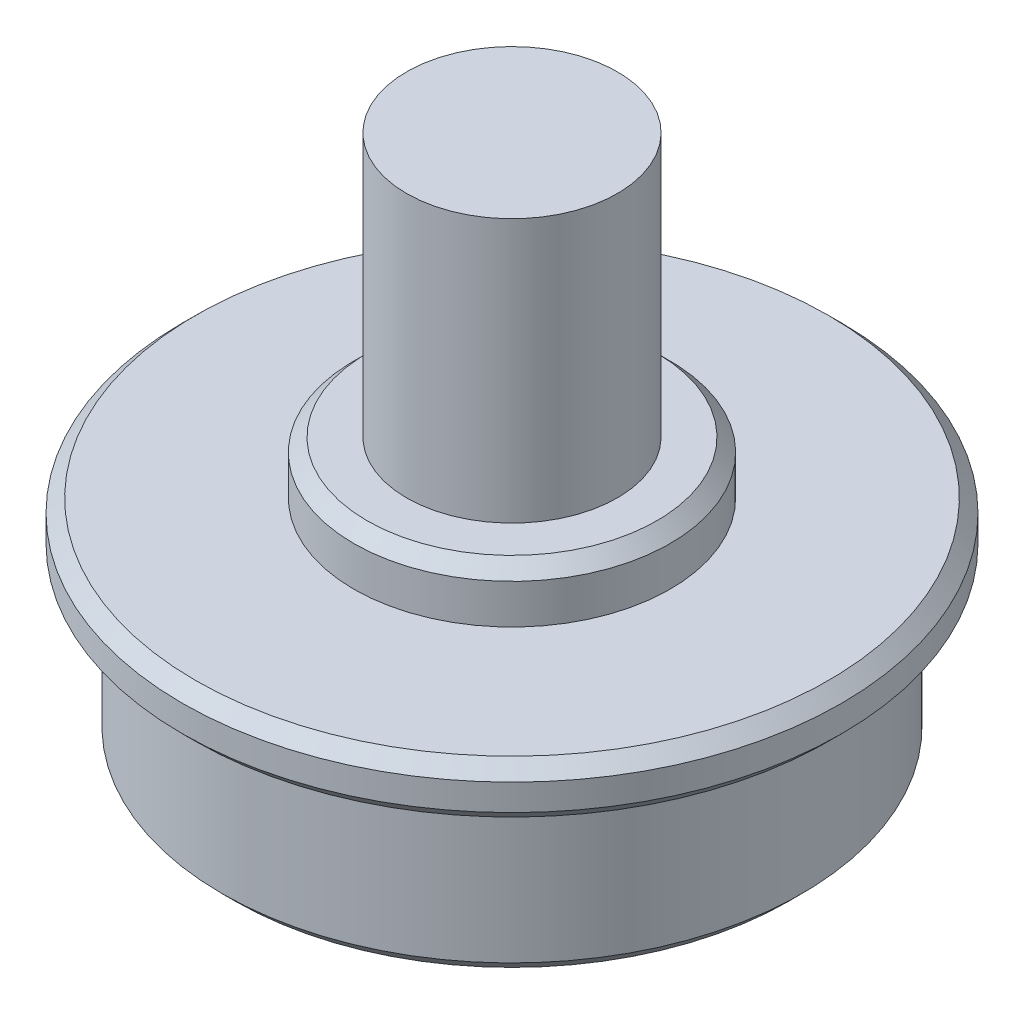
ISO-10303-21;
HEADER;
FILE_DESCRIPTION(('STEP AP214'),'2;1');
FILE_NAME('part.step','',(''),(''),'','','');
FILE_SCHEMA(('AUTOMOTIVE_DESIGN { 1 0 10303 214 1 1 1 1 }'));
ENDSEC;
DATA;
#1=APPLICATION_CONTEXT('core data for automotive mechanical design processes');
#2=APPLICATION_PROTOCOL_DEFINITION('international standard','automotive_design',2000,#1);
#3=PRODUCT_CONTEXT('',#1,'mechanical');
#4=PRODUCT('Part','Part','',(#3));
#5=PRODUCT_RELATED_PRODUCT_CATEGORY('part','',(#4));
#6=PRODUCT_DEFINITION_FORMATION('','',#4);
#7=PRODUCT_DEFINITION_CONTEXT('part definition',#1,'design');
#8=PRODUCT_DEFINITION('design','',#6,#7);
#9=PRODUCT_DEFINITION_SHAPE('','',#8);
#10=(LENGTH_UNIT() NAMED_UNIT(*) SI_UNIT(.MILLI.,.METRE.));
#11=(NAMED_UNIT(*) PLANE_ANGLE_UNIT() SI_UNIT($,.RADIAN.));
#12=(NAMED_UNIT(*) SI_UNIT($,.STERADIAN.) SOLID_ANGLE_UNIT());
#13=UNCERTAINTY_MEASURE_WITH_UNIT(LENGTH_MEASURE(1.E-05),#10,'distance_accuracy_value','');
#14=(GEOMETRIC_REPRESENTATION_CONTEXT(3) GLOBAL_UNCERTAINTY_ASSIGNED_CONTEXT((#13)) GLOBAL_UNIT_ASSIGNED_CONTEXT((#10,
#11,#12)) REPRESENTATION_CONTEXT('',''));
#15=CARTESIAN_POINT('',(0.,0.,0.));
#16=DIRECTION('',(0.,0.,1.));
#17=DIRECTION('',(1.,0.,0.));
#18=AXIS2_PLACEMENT_3D('',#15,#16,#17);
#19=CARTESIAN_POINT('',(0.,1.,0.));
#20=DIRECTION('',(0.,-1.,0.));
#21=DIRECTION('',(0.,0.,-1.));
#22=AXIS2_PLACEMENT_3D('',#19,#20,#21);
#23=CYLINDRICAL_SURFACE('',#22,6.25);
#24=CARTESIAN_POINT('',(0.,0.250000000000003,0.));
#25=DIRECTION('',(0.,1.,0.));
#26=DIRECTION('',(0.,0.,1.));
#27=AXIS2_PLACEMENT_3D('',#24,#25,#26);
#28=CIRCLE('',#27,6.25);
#29=CARTESIAN_POINT('',(0.,0.250000000000003,6.25));
#30=VERTEX_POINT('',#29);
#31=EDGE_CURVE('E78',#30,#30,#28,.T.);
#32=ORIENTED_EDGE('',*,*,#31,.T.);
#33=EDGE_LOOP('',(#32));
#34=FACE_BOUND('',#33,.T.);
#35=CARTESIAN_POINT('',(0.,0.749999999999999,0.));
#36=DIRECTION('',(0.,1.,0.));
#37=DIRECTION('',(0.,0.,1.));
#38=AXIS2_PLACEMENT_3D('',#35,#36,#37);
#39=CIRCLE('',#38,6.25);
#40=CARTESIAN_POINT('',(0.,0.749999999999999,6.25));
#41=VERTEX_POINT('',#40);
#42=EDGE_CURVE('E82',#41,#41,#39,.F.);
#43=ORIENTED_EDGE('',*,*,#42,.T.);
#44=EDGE_LOOP('',(#43));
#45=FACE_BOUND('',#44,.T.);
#46=ADVANCED_FACE('F45',(#34,#45),#23,.T.);
#47=CARTESIAN_POINT('',(0.,1.,0.));
#48=DIRECTION('',(0.,1.,0.));
#49=DIRECTION('',(0.,0.,1.));
#50=AXIS2_PLACEMENT_3D('',#47,#48,#49);
#51=PLANE('',#50);
#52=CARTESIAN_POINT('',(0.,1.,0.));
#53=DIRECTION('',(0.,1.,0.));
#54=DIRECTION('',(0.,0.,1.));
#55=AXIS2_PLACEMENT_3D('',#52,#53,#54);
#56=CIRCLE('',#55,6.);
#57=CARTESIAN_POINT('',(0.,1.,6.));
#58=VERTEX_POINT('',#57);
#59=EDGE_CURVE('E59',#58,#58,#56,.T.);
#60=ORIENTED_EDGE('',*,*,#59,.T.);
#61=EDGE_LOOP('',(#60));
#62=FACE_BOUND('',#61,.T.);
#63=CARTESIAN_POINT('',(0.,1.,0.));
#64=DIRECTION('',(0.,1.,0.));
#65=DIRECTION('',(0.,0.,1.));
#66=AXIS2_PLACEMENT_3D('',#63,#64,#65);
#67=CIRCLE('',#66,3.);
#68=CARTESIAN_POINT('',(0.,1.,3.));
#69=VERTEX_POINT('',#68);
#70=EDGE_CURVE('E91',#69,#69,#67,.T.);
#71=ORIENTED_EDGE('',*,*,#70,.F.);
#72=EDGE_LOOP('',(#71));
#73=FACE_BOUND('',#72,.T.);
#74=ADVANCED_FACE('F121',(#62,#73),#51,.T.);
#75=CARTESIAN_POINT('',(0.,0.,0.));
#76=DIRECTION('',(0.,1.,0.));
#77=DIRECTION('',(0.,0.,1.));
#78=AXIS2_PLACEMENT_3D('',#75,#76,#77);
#79=PLANE('',#78);
#80=CARTESIAN_POINT('',(0.,0.,0.));
#81=DIRECTION('',(0.,1.,0.));
#82=DIRECTION('',(0.,0.,1.));
#83=AXIS2_PLACEMENT_3D('',#80,#81,#82);
#84=CIRCLE('',#83,6.);
#85=CARTESIAN_POINT('',(0.,0.,6.));
#86=VERTEX_POINT('',#85);
#87=EDGE_CURVE('E74',#86,#86,#84,.F.);
#88=ORIENTED_EDGE('',*,*,#87,.T.);
#89=EDGE_LOOP('',(#88));
#90=FACE_BOUND('',#89,.T.);
#91=CARTESIAN_POINT('',(0.,0.,0.));
#92=DIRECTION('',(0.,-1.,0.));
#93=DIRECTION('',(0.,0.,-1.));
#94=AXIS2_PLACEMENT_3D('',#91,#92,#93);
#95=CIRCLE('',#94,5.5);
#96=CARTESIAN_POINT('',(0.,0.,-5.5));
#97=VERTEX_POINT('',#96);
#98=EDGE_CURVE('E87',#97,#97,#95,.T.);
#99=ORIENTED_EDGE('',*,*,#98,.F.);
#100=EDGE_LOOP('',(#99));
#101=FACE_BOUND('',#100,.T.);
#102=ADVANCED_FACE('F127',(#90,#101),#79,.F.);
#103=CARTESIAN_POINT('',(0.,-3.,0.));
#104=DIRECTION('',(0.,1.,0.));
#105=DIRECTION('',(0.,0.,1.));
#106=AXIS2_PLACEMENT_3D('',#103,#104,#105);
#107=CYLINDRICAL_SURFACE('',#106,5.5);
#108=CARTESIAN_POINT('',(0.,-2.74999999999999,0.));
#109=DIRECTION('',(0.,-1.,0.));
#110=DIRECTION('',(0.,0.,-1.));
#111=AXIS2_PLACEMENT_3D('',#108,#109,#110);
#112=CIRCLE('',#111,5.5);
#113=CARTESIAN_POINT('',(0.,-2.74999999999999,-5.5));
#114=VERTEX_POINT('',#113);
#115=EDGE_CURVE('E64',#114,#114,#112,.F.);
#116=ORIENTED_EDGE('',*,*,#115,.T.);
#117=EDGE_LOOP('',(#116));
#118=FACE_BOUND('',#117,.T.);
#119=ORIENTED_EDGE('',*,*,#98,.T.);
#120=EDGE_LOOP('',(#119));
#121=FACE_BOUND('',#120,.T.);
#122=ADVANCED_FACE('F203',(#118,#121),#107,.T.);
#123=CARTESIAN_POINT('',(0.,-3.,0.));
#124=DIRECTION('',(0.,-1.,0.));
#125=DIRECTION('',(0.,0.,-1.));
#126=AXIS2_PLACEMENT_3D('',#123,#124,#125);
#127=PLANE('',#126);
#128=CARTESIAN_POINT('',(0.,-3.,0.));
#129=DIRECTION('',(0.,-1.,0.));
#130=DIRECTION('',(0.,0.,-1.));
#131=AXIS2_PLACEMENT_3D('',#128,#129,#130);
#132=CIRCLE('',#131,5.25);
#133=CARTESIAN_POINT('',(0.,-3.,-5.25));
#134=VERTEX_POINT('',#133);
#135=EDGE_CURVE('E70',#134,#134,#132,.T.);
#136=ORIENTED_EDGE('',*,*,#135,.T.);
#137=EDGE_LOOP('',(#136));
#138=FACE_BOUND('',#137,.T.);
#139=ADVANCED_FACE('F118',(#138),#127,.T.);
#140=CARTESIAN_POINT('',(0.,2.,0.));
#141=DIRECTION('',(0.,-1.,0.));
#142=DIRECTION('',(0.,0.,-1.));
#143=AXIS2_PLACEMENT_3D('',#140,#141,#142);
#144=CYLINDRICAL_SURFACE('',#143,3.);
#145=CARTESIAN_POINT('',(0.,1.75,0.));
#146=DIRECTION('',(0.,1.,0.));
#147=DIRECTION('',(0.,0.,1.));
#148=AXIS2_PLACEMENT_3D('',#145,#146,#147);
#149=CIRCLE('',#148,3.);
#150=CARTESIAN_POINT('',(0.,1.75,3.));
#151=VERTEX_POINT('',#150);
#152=EDGE_CURVE('E10',#151,#151,#149,.F.);
#153=ORIENTED_EDGE('',*,*,#152,.T.);
#154=EDGE_LOOP('',(#153));
#155=FACE_BOUND('',#154,.T.);
#156=ORIENTED_EDGE('',*,*,#70,.T.);
#157=EDGE_LOOP('',(#156));
#158=FACE_BOUND('',#157,.T.);
#159=ADVANCED_FACE('F113',(#155,#158),#144,.T.);
#160=CARTESIAN_POINT('',(0.,2.,0.));
#161=DIRECTION('',(0.,1.,0.));
#162=DIRECTION('',(0.,0.,1.));
#163=AXIS2_PLACEMENT_3D('',#160,#161,#162);
#164=PLANE('',#163);
#165=CARTESIAN_POINT('',(0.,2.,0.));
#166=DIRECTION('',(0.,1.,0.));
#167=DIRECTION('',(0.,0.,1.));
#168=AXIS2_PLACEMENT_3D('',#165,#166,#167);
#169=CIRCLE('',#168,2.75000000000001);
#170=CARTESIAN_POINT('',(0.,2.,2.75000000000001));
#171=VERTEX_POINT('',#170);
#172=EDGE_CURVE('E54',#171,#171,#169,.T.);
#173=ORIENTED_EDGE('',*,*,#172,.T.);
#174=EDGE_LOOP('',(#173));
#175=FACE_BOUND('',#174,.T.);
#176=CARTESIAN_POINT('',(0.,2.,0.));
#177=DIRECTION('',(0.,1.,0.));
#178=DIRECTION('',(0.,0.,1.));
#179=AXIS2_PLACEMENT_3D('',#176,#177,#178);
#180=CIRCLE('',#179,2.);
#181=CARTESIAN_POINT('',(0.,2.,2.));
#182=VERTEX_POINT('',#181);
#183=EDGE_CURVE('E86',#182,#182,#180,.T.);
#184=ORIENTED_EDGE('',*,*,#183,.F.);
#185=EDGE_LOOP('',(#184));
#186=FACE_BOUND('',#185,.T.);
#187=ADVANCED_FACE('F108',(#175,#186),#164,.T.);
#188=CARTESIAN_POINT('',(0.,7.,0.));
#189=DIRECTION('',(0.,-1.,0.));
#190=DIRECTION('',(0.,0.,-1.));
#191=AXIS2_PLACEMENT_3D('',#188,#189,#190);
#192=CYLINDRICAL_SURFACE('',#191,2.);
#193=CARTESIAN_POINT('',(0.,7.,0.));
#194=DIRECTION('',(0.,1.,0.));
#195=DIRECTION('',(0.,0.,1.));
#196=AXIS2_PLACEMENT_3D('',#193,#194,#195);
#197=CIRCLE('',#196,2.);
#198=CARTESIAN_POINT('',(0.,7.,2.));
#199=VERTEX_POINT('',#198);
#200=EDGE_CURVE('E92',#199,#199,#197,.T.);
#201=ORIENTED_EDGE('',*,*,#200,.F.);
#202=EDGE_LOOP('',(#201));
#203=FACE_BOUND('',#202,.T.);
#204=ORIENTED_EDGE('',*,*,#183,.T.);
#205=EDGE_LOOP('',(#204));
#206=FACE_BOUND('',#205,.T.);
#207=ADVANCED_FACE('F105',(#203,#206),#192,.T.);
#208=CARTESIAN_POINT('',(0.,7.,0.));
#209=DIRECTION('',(0.,1.,0.));
#210=DIRECTION('',(0.,0.,1.));
#211=AXIS2_PLACEMENT_3D('',#208,#209,#210);
#212=PLANE('',#211);
#213=ORIENTED_EDGE('',*,*,#200,.T.);
#214=EDGE_LOOP('',(#213));
#215=FACE_BOUND('',#214,.T.);
#216=ADVANCED_FACE('F103',(#215),#212,.T.);
#217=CARTESIAN_POINT('',(0.,0.250000000000003,0.));
#218=DIRECTION('',(0.,1.,0.));
#219=DIRECTION('',(0.,0.,1.));
#220=AXIS2_PLACEMENT_3D('',#217,#218,#219);
#221=CONICAL_SURFACE('',#220,6.25,0.785398163397447);
#222=ORIENTED_EDGE('',*,*,#87,.F.);
#223=EDGE_LOOP('',(#222));
#224=FACE_BOUND('',#223,.T.);
#225=ORIENTED_EDGE('',*,*,#31,.F.);
#226=EDGE_LOOP('',(#225));
#227=FACE_BOUND('',#226,.T.);
#228=ADVANCED_FACE('F134',(#224,#227),#221,.T.);
#229=CARTESIAN_POINT('',(0.,-3.,0.));
#230=DIRECTION('',(0.,1.,0.));
#231=DIRECTION('',(0.,0.,1.));
#232=AXIS2_PLACEMENT_3D('',#229,#230,#231);
#233=CONICAL_SURFACE('',#232,5.25,0.785398163397441);
#234=ORIENTED_EDGE('',*,*,#115,.F.);
#235=EDGE_LOOP('',(#234));
#236=FACE_BOUND('',#235,.T.);
#237=ORIENTED_EDGE('',*,*,#135,.F.);
#238=EDGE_LOOP('',(#237));
#239=FACE_BOUND('',#238,.T.);
#240=ADVANCED_FACE('F140',(#236,#239),#233,.T.);
#241=CARTESIAN_POINT('',(0.,1.,0.));
#242=DIRECTION('',(0.,-1.,0.));
#243=DIRECTION('',(0.,0.,-1.));
#244=AXIS2_PLACEMENT_3D('',#241,#242,#243);
#245=CONICAL_SURFACE('',#244,6.,0.78539816339745);
#246=ORIENTED_EDGE('',*,*,#42,.F.);
#247=EDGE_LOOP('',(#246));
#248=FACE_BOUND('',#247,.T.);
#249=ORIENTED_EDGE('',*,*,#59,.F.);
#250=EDGE_LOOP('',(#249));
#251=FACE_BOUND('',#250,.T.);
#252=ADVANCED_FACE('F146',(#248,#251),#245,.T.);
#253=CARTESIAN_POINT('',(0.,2.,0.));
#254=DIRECTION('',(0.,-1.,0.));
#255=DIRECTION('',(0.,0.,-1.));
#256=AXIS2_PLACEMENT_3D('',#253,#254,#255);
#257=CONICAL_SURFACE('',#256,2.75000000000001,0.785398163397444);
#258=ORIENTED_EDGE('',*,*,#152,.F.);
#259=EDGE_LOOP('',(#258));
#260=FACE_BOUND('',#259,.T.);
#261=ORIENTED_EDGE('',*,*,#172,.F.);
#262=EDGE_LOOP('',(#261));
#263=FACE_BOUND('',#262,.T.);
#264=ADVANCED_FACE('F48',(#260,#263),#257,.T.);
#265=CLOSED_SHELL('',(#46,#74,#102,#122,#139,#159,#187,#207,#216,#228,#240,#252,#264));
#266=MANIFOLD_SOLID_BREP('B2',#265);
#267=ADVANCED_BREP_SHAPE_REPRESENTATION('',(#18,#266),#14);
#268=SHAPE_DEFINITION_REPRESENTATION(#9,#267);
ENDSEC;
END-ISO-10303-21;
